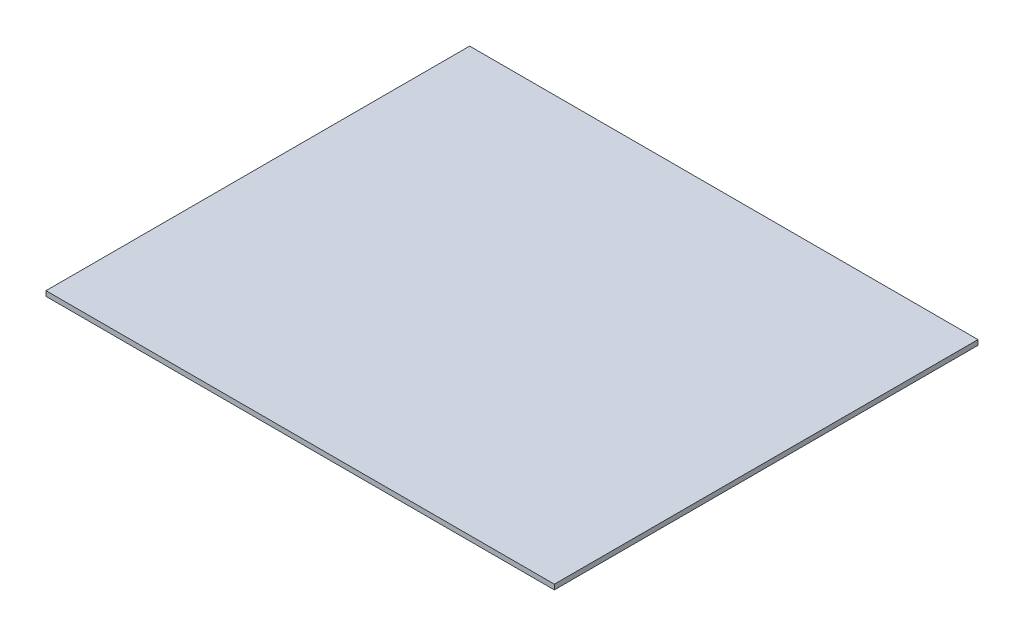
ISO-10303-21;
HEADER;
FILE_DESCRIPTION(('STEP AP214'),'2;1');
FILE_NAME('part.step','',(''),(''),'','','');
FILE_SCHEMA(('AUTOMOTIVE_DESIGN { 1 0 10303 214 1 1 1 1 }'));
ENDSEC;
DATA;
#1=APPLICATION_CONTEXT('core data for automotive mechanical design processes');
#2=APPLICATION_PROTOCOL_DEFINITION('international standard','automotive_design',2000,#1);
#3=PRODUCT_CONTEXT('',#1,'mechanical');
#4=PRODUCT('Part','Part','',(#3));
#5=PRODUCT_RELATED_PRODUCT_CATEGORY('part','',(#4));
#6=PRODUCT_DEFINITION_FORMATION('','',#4);
#7=PRODUCT_DEFINITION_CONTEXT('part definition',#1,'design');
#8=PRODUCT_DEFINITION('design','',#6,#7);
#9=PRODUCT_DEFINITION_SHAPE('','',#8);
#10=(LENGTH_UNIT() NAMED_UNIT(*) SI_UNIT(.MILLI.,.METRE.));
#11=(NAMED_UNIT(*) PLANE_ANGLE_UNIT() SI_UNIT($,.RADIAN.));
#12=(NAMED_UNIT(*) SI_UNIT($,.STERADIAN.) SOLID_ANGLE_UNIT());
#13=UNCERTAINTY_MEASURE_WITH_UNIT(LENGTH_MEASURE(1.E-05),#10,'distance_accuracy_value','');
#14=(GEOMETRIC_REPRESENTATION_CONTEXT(3) GLOBAL_UNCERTAINTY_ASSIGNED_CONTEXT((#13)) GLOBAL_UNIT_ASSIGNED_CONTEXT((#10,
#11,#12)) REPRESENTATION_CONTEXT('',''));
#15=CARTESIAN_POINT('',(0.,0.,0.));
#16=DIRECTION('',(0.,0.,1.));
#17=DIRECTION('',(1.,0.,0.));
#18=AXIS2_PLACEMENT_3D('',#15,#16,#17);
#19=CARTESIAN_POINT('',(51.,0.5,-42.5));
#20=DIRECTION('',(-1.,0.,0.));
#21=DIRECTION('',(0.,0.,1.));
#22=AXIS2_PLACEMENT_3D('',#19,#20,#21);
#23=PLANE('',#22);
#24=DIRECTION('',(0.,0.,-1.));
#25=VECTOR('',#24,1.);
#26=CARTESIAN_POINT('',(51.,-0.5,-42.5));
#27=LINE('',#26,#25);
#28=CARTESIAN_POINT('',(51.,-0.5,42.5));
#29=VERTEX_POINT('',#28);
#30=CARTESIAN_POINT('',(51.,-0.5,-42.5));
#31=VERTEX_POINT('',#30);
#32=EDGE_CURVE('E96',#29,#31,#27,.T.);
#33=ORIENTED_EDGE('',*,*,#32,.T.);
#34=DIRECTION('',(0.,-1.,0.));
#35=VECTOR('',#34,1.);
#36=CARTESIAN_POINT('',(51.,0.5,-42.5));
#37=LINE('',#36,#35);
#38=CARTESIAN_POINT('',(51.,0.5,-42.5));
#39=VERTEX_POINT('',#38);
#40=EDGE_CURVE('E11',#39,#31,#37,.T.);
#41=ORIENTED_EDGE('',*,*,#40,.F.);
#42=DIRECTION('',(0.,0.,-1.));
#43=VECTOR('',#42,1.);
#44=CARTESIAN_POINT('',(51.,0.5,-42.5));
#45=LINE('',#44,#43);
#46=CARTESIAN_POINT('',(51.,0.5,42.5));
#47=VERTEX_POINT('',#46);
#48=EDGE_CURVE('E84',#47,#39,#45,.T.);
#49=ORIENTED_EDGE('',*,*,#48,.F.);
#50=DIRECTION('',(0.,-1.,0.));
#51=VECTOR('',#50,1.);
#52=CARTESIAN_POINT('',(51.,0.5,42.5));
#53=LINE('',#52,#51);
#54=EDGE_CURVE('E92',#47,#29,#53,.T.);
#55=ORIENTED_EDGE('',*,*,#54,.T.);
#56=EDGE_LOOP('',(#33,#41,#49,#55));
#57=FACE_BOUND('',#56,.T.);
#58=ADVANCED_FACE('F33',(#57),#23,.F.);
#59=CARTESIAN_POINT('',(-51.,0.5,-42.5));
#60=DIRECTION('',(0.,0.,1.));
#61=DIRECTION('',(1.,0.,0.));
#62=AXIS2_PLACEMENT_3D('',#59,#60,#61);
#63=PLANE('',#62);
#64=DIRECTION('',(-1.,0.,0.));
#65=VECTOR('',#64,1.);
#66=CARTESIAN_POINT('',(-51.,-0.5,-42.5));
#67=LINE('',#66,#65);
#68=CARTESIAN_POINT('',(-51.,-0.5,-42.5));
#69=VERTEX_POINT('',#68);
#70=EDGE_CURVE('E88',#31,#69,#67,.T.);
#71=ORIENTED_EDGE('',*,*,#70,.T.);
#72=DIRECTION('',(0.,-1.,0.));
#73=VECTOR('',#72,1.);
#74=CARTESIAN_POINT('',(-51.,0.5,-42.5));
#75=LINE('',#74,#73);
#76=CARTESIAN_POINT('',(-51.,0.5,-42.5));
#77=VERTEX_POINT('',#76);
#78=EDGE_CURVE('E41',#77,#69,#75,.T.);
#79=ORIENTED_EDGE('',*,*,#78,.F.);
#80=DIRECTION('',(-1.,0.,0.));
#81=VECTOR('',#80,1.);
#82=CARTESIAN_POINT('',(-51.,0.5,-42.5));
#83=LINE('',#82,#81);
#84=EDGE_CURVE('E79',#39,#77,#83,.T.);
#85=ORIENTED_EDGE('',*,*,#84,.F.);
#86=ORIENTED_EDGE('',*,*,#40,.T.);
#87=EDGE_LOOP('',(#71,#79,#85,#86));
#88=FACE_BOUND('',#87,.T.);
#89=ADVANCED_FACE('F87',(#88),#63,.F.);
#90=CARTESIAN_POINT('',(-51.,0.5,-42.5));
#91=DIRECTION('',(1.,0.,0.));
#92=DIRECTION('',(0.,0.,-1.));
#93=AXIS2_PLACEMENT_3D('',#90,#91,#92);
#94=PLANE('',#93);
#95=DIRECTION('',(0.,0.,1.));
#96=VECTOR('',#95,1.);
#97=CARTESIAN_POINT('',(-51.,-0.5,-42.5));
#98=LINE('',#97,#96);
#99=CARTESIAN_POINT('',(-51.,-0.5,42.5));
#100=VERTEX_POINT('',#99);
#101=EDGE_CURVE('E66',#69,#100,#98,.T.);
#102=ORIENTED_EDGE('',*,*,#101,.T.);
#103=DIRECTION('',(0.,-1.,0.));
#104=VECTOR('',#103,1.);
#105=CARTESIAN_POINT('',(-51.,0.5,42.5));
#106=LINE('',#105,#104);
#107=CARTESIAN_POINT('',(-51.,0.5,42.5));
#108=VERTEX_POINT('',#107);
#109=EDGE_CURVE('E89',#108,#100,#106,.T.);
#110=ORIENTED_EDGE('',*,*,#109,.F.);
#111=DIRECTION('',(0.,0.,1.));
#112=VECTOR('',#111,1.);
#113=CARTESIAN_POINT('',(-51.,0.5,-42.5));
#114=LINE('',#113,#112);
#115=EDGE_CURVE('E82',#77,#108,#114,.T.);
#116=ORIENTED_EDGE('',*,*,#115,.F.);
#117=ORIENTED_EDGE('',*,*,#78,.T.);
#118=EDGE_LOOP('',(#102,#110,#116,#117));
#119=FACE_BOUND('',#118,.T.);
#120=ADVANCED_FACE('F90',(#119),#94,.F.);
#121=CARTESIAN_POINT('',(-51.,0.5,42.5));
#122=DIRECTION('',(0.,0.,-1.));
#123=DIRECTION('',(-1.,0.,0.));
#124=AXIS2_PLACEMENT_3D('',#121,#122,#123);
#125=PLANE('',#124);
#126=DIRECTION('',(1.,0.,0.));
#127=VECTOR('',#126,1.);
#128=CARTESIAN_POINT('',(-51.,-0.5,42.5));
#129=LINE('',#128,#127);
#130=EDGE_CURVE('E72',#100,#29,#129,.T.);
#131=ORIENTED_EDGE('',*,*,#130,.T.);
#132=ORIENTED_EDGE('',*,*,#54,.F.);
#133=DIRECTION('',(1.,0.,0.));
#134=VECTOR('',#133,1.);
#135=CARTESIAN_POINT('',(-51.,0.5,42.5));
#136=LINE('',#135,#134);
#137=EDGE_CURVE('E49',#108,#47,#136,.T.);
#138=ORIENTED_EDGE('',*,*,#137,.F.);
#139=ORIENTED_EDGE('',*,*,#109,.T.);
#140=EDGE_LOOP('',(#131,#132,#138,#139));
#141=FACE_BOUND('',#140,.T.);
#142=ADVANCED_FACE('F103',(#141),#125,.F.);
#143=CARTESIAN_POINT('',(0.,0.5,0.));
#144=DIRECTION('',(0.,1.,0.));
#145=DIRECTION('',(0.,0.,1.));
#146=AXIS2_PLACEMENT_3D('',#143,#144,#145);
#147=PLANE('',#146);
#148=ORIENTED_EDGE('',*,*,#48,.T.);
#149=ORIENTED_EDGE('',*,*,#84,.T.);
#150=ORIENTED_EDGE('',*,*,#115,.T.);
#151=ORIENTED_EDGE('',*,*,#137,.T.);
#152=EDGE_LOOP('',(#148,#149,#150,#151));
#153=FACE_BOUND('',#152,.T.);
#154=ADVANCED_FACE('F80',(#153),#147,.T.);
#155=CARTESIAN_POINT('',(0.,-0.5,0.));
#156=DIRECTION('',(0.,1.,0.));
#157=DIRECTION('',(0.,0.,1.));
#158=AXIS2_PLACEMENT_3D('',#155,#156,#157);
#159=PLANE('',#158);
#160=ORIENTED_EDGE('',*,*,#32,.F.);
#161=ORIENTED_EDGE('',*,*,#130,.F.);
#162=ORIENTED_EDGE('',*,*,#101,.F.);
#163=ORIENTED_EDGE('',*,*,#70,.F.);
#164=EDGE_LOOP('',(#160,#161,#162,#163));
#165=FACE_BOUND('',#164,.T.);
#166=ADVANCED_FACE('F106',(#165),#159,.F.);
#167=CLOSED_SHELL('',(#58,#89,#120,#142,#154,#166));
#168=MANIFOLD_SOLID_BREP('B2',#167);
#169=ADVANCED_BREP_SHAPE_REPRESENTATION('',(#18,#168),#14);
#170=SHAPE_DEFINITION_REPRESENTATION(#9,#169);
ENDSEC;
END-ISO-10303-21;
